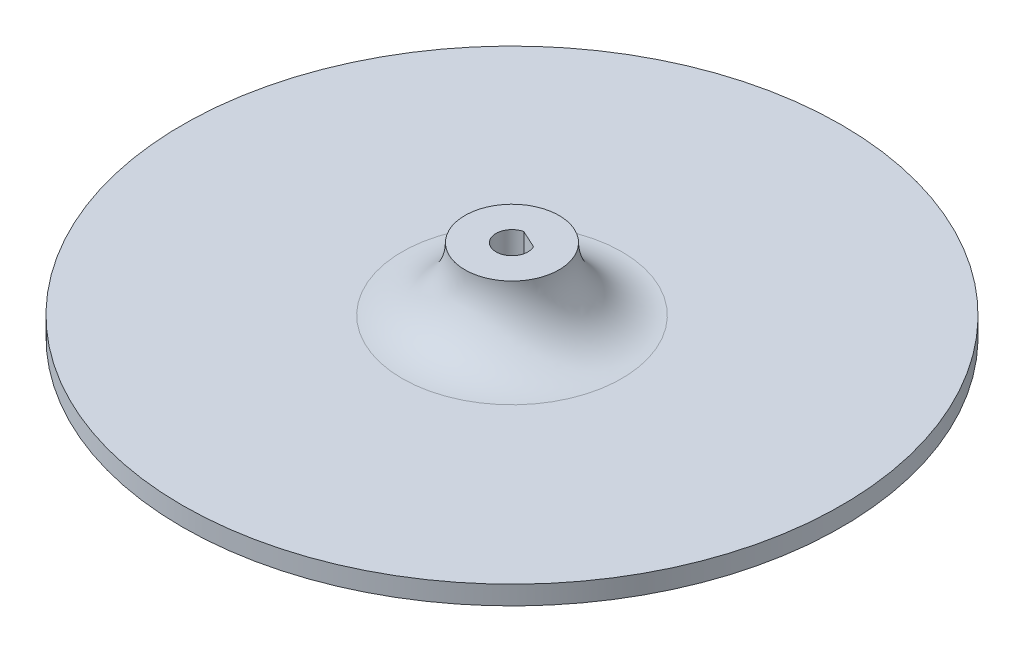
ISO-10303-21;
HEADER;
FILE_DESCRIPTION(('STEP AP214'),'2;1');
FILE_NAME('part.step','',(''),(''),'','','');
FILE_SCHEMA(('AUTOMOTIVE_DESIGN { 1 0 10303 214 1 1 1 1 }'));
ENDSEC;
DATA;
#1=APPLICATION_CONTEXT('core data for automotive mechanical design processes');
#2=APPLICATION_PROTOCOL_DEFINITION('international standard','automotive_design',2000,#1);
#3=PRODUCT_CONTEXT('',#1,'mechanical');
#4=PRODUCT('Part','Part','',(#3));
#5=PRODUCT_RELATED_PRODUCT_CATEGORY('part','',(#4));
#6=PRODUCT_DEFINITION_FORMATION('','',#4);
#7=PRODUCT_DEFINITION_CONTEXT('part definition',#1,'design');
#8=PRODUCT_DEFINITION('design','',#6,#7);
#9=PRODUCT_DEFINITION_SHAPE('','',#8);
#10=(LENGTH_UNIT() NAMED_UNIT(*) SI_UNIT(.MILLI.,.METRE.));
#11=(NAMED_UNIT(*) PLANE_ANGLE_UNIT() SI_UNIT($,.RADIAN.));
#12=(NAMED_UNIT(*) SI_UNIT($,.STERADIAN.) SOLID_ANGLE_UNIT());
#13=UNCERTAINTY_MEASURE_WITH_UNIT(LENGTH_MEASURE(1.E-05),#10,'distance_accuracy_value','');
#14=(GEOMETRIC_REPRESENTATION_CONTEXT(3) GLOBAL_UNCERTAINTY_ASSIGNED_CONTEXT((#13)) GLOBAL_UNIT_ASSIGNED_CONTEXT((#10,
#11,#12)) REPRESENTATION_CONTEXT('',''));
#15=CARTESIAN_POINT('',(0.,0.,0.));
#16=DIRECTION('',(0.,0.,1.));
#17=DIRECTION('',(1.,0.,0.));
#18=AXIS2_PLACEMENT_3D('',#15,#16,#17);
#19=CARTESIAN_POINT('',(0.,-3.,0.));
#20=DIRECTION('',(0.,1.,0.));
#21=DIRECTION('',(0.,0.,1.));
#22=AXIS2_PLACEMENT_3D('',#19,#20,#21);
#23=CYLINDRICAL_SURFACE('',#22,52.5);
#24=CARTESIAN_POINT('',(0.,-3.,0.));
#25=DIRECTION('',(0.,1.,0.));
#26=DIRECTION('',(0.,0.,1.));
#27=AXIS2_PLACEMENT_3D('',#24,#25,#26);
#28=CIRCLE('',#27,52.5);
#29=CARTESIAN_POINT('',(0.,-3.,52.5));
#30=VERTEX_POINT('',#29);
#31=EDGE_CURVE('E42',#30,#30,#28,.T.);
#32=ORIENTED_EDGE('',*,*,#31,.T.);
#33=EDGE_LOOP('',(#32));
#34=FACE_BOUND('',#33,.T.);
#35=CARTESIAN_POINT('',(0.,0.,0.));
#36=DIRECTION('',(0.,1.,0.));
#37=DIRECTION('',(0.,0.,1.));
#38=AXIS2_PLACEMENT_3D('',#35,#36,#37);
#39=CIRCLE('',#38,52.5);
#40=CARTESIAN_POINT('',(0.,0.,52.5));
#41=VERTEX_POINT('',#40);
#42=EDGE_CURVE('E80',#41,#41,#39,.T.);
#43=ORIENTED_EDGE('',*,*,#42,.F.);
#44=EDGE_LOOP('',(#43));
#45=FACE_BOUND('',#44,.T.);
#46=ADVANCED_FACE('F34',(#34,#45),#23,.T.);
#47=CARTESIAN_POINT('',(0.,-3.,0.));
#48=DIRECTION('',(0.,1.,0.));
#49=DIRECTION('',(0.,0.,1.));
#50=AXIS2_PLACEMENT_3D('',#47,#48,#49);
#51=PLANE('',#50);
#52=ORIENTED_EDGE('',*,*,#31,.F.);
#53=EDGE_LOOP('',(#52));
#54=FACE_BOUND('',#53,.T.);
#55=ADVANCED_FACE('F88',(#54),#51,.F.);
#56=CARTESIAN_POINT('',(0.,0.,0.));
#57=DIRECTION('',(0.,1.,0.));
#58=DIRECTION('',(0.,0.,1.));
#59=AXIS2_PLACEMENT_3D('',#56,#57,#58);
#60=PLANE('',#59);
#61=CARTESIAN_POINT('',(0.,0.,0.));
#62=DIRECTION('',(0.,1.,0.));
#63=DIRECTION('',(0.,0.,1.));
#64=AXIS2_PLACEMENT_3D('',#61,#62,#63);
#65=CIRCLE('',#64,17.5);
#66=CARTESIAN_POINT('',(0.,0.,17.5));
#67=VERTEX_POINT('',#66);
#68=EDGE_CURVE('E11',#67,#67,#65,.F.);
#69=ORIENTED_EDGE('',*,*,#68,.T.);
#70=EDGE_LOOP('',(#69));
#71=FACE_BOUND('',#70,.T.);
#72=ORIENTED_EDGE('',*,*,#42,.T.);
#73=EDGE_LOOP('',(#72));
#74=FACE_BOUND('',#73,.T.);
#75=ADVANCED_FACE('F85',(#71,#74),#60,.T.);
#76=CARTESIAN_POINT('',(0.835680038711691,10.,-1.81704124138634));
#77=DIRECTION('',(0.417840019355846,0.,-0.908520620693172));
#78=DIRECTION('',(-0.908520620693172,0.,-0.417840019355846));
#79=AXIS2_PLACEMENT_3D('',#76,#77,#78);
#80=PLANE('',#79);
#81=DIRECTION('',(0.908520620693172,0.,0.417840019355846));
#82=VECTOR('',#81,1.);
#83=CARTESIAN_POINT('',(0.835680038711691,0.,-1.81704124138634));
#84=LINE('',#83,#82);
#85=CARTESIAN_POINT('',(-0.601535261741699,0.,-2.47803456975106));
#86=VERTEX_POINT('',#85);
#87=CARTESIAN_POINT('',(2.27289533916508,0.,-1.15604791302162));
#88=VERTEX_POINT('',#87);
#89=EDGE_CURVE('E62',#86,#88,#84,.T.);
#90=ORIENTED_EDGE('',*,*,#89,.T.);
#91=DIRECTION('',(0.,-1.,0.));
#92=VECTOR('',#91,1.);
#93=CARTESIAN_POINT('',(2.27289533916508,10.,-1.15604791302162));
#94=LINE('',#93,#92);
#95=CARTESIAN_POINT('',(2.27289533916508,10.,-1.15604791302162));
#96=VERTEX_POINT('',#95);
#97=EDGE_CURVE('E70',#96,#88,#94,.T.);
#98=ORIENTED_EDGE('',*,*,#97,.F.);
#99=DIRECTION('',(0.908520620693172,0.,0.417840019355846));
#100=VECTOR('',#99,1.);
#101=CARTESIAN_POINT('',(0.835680038711691,10.,-1.81704124138634));
#102=LINE('',#101,#100);
#103=CARTESIAN_POINT('',(-0.601535261741699,10.,-2.47803456975106));
#104=VERTEX_POINT('',#103);
#105=EDGE_CURVE('E68',#104,#96,#102,.T.);
#106=ORIENTED_EDGE('',*,*,#105,.F.);
#107=DIRECTION('',(0.,-1.,0.));
#108=VECTOR('',#107,1.);
#109=CARTESIAN_POINT('',(-0.601535261741699,10.,-2.47803456975106));
#110=LINE('',#109,#108);
#111=EDGE_CURVE('E56',#104,#86,#110,.T.);
#112=ORIENTED_EDGE('',*,*,#111,.T.);
#113=EDGE_LOOP('',(#90,#98,#106,#112));
#114=FACE_BOUND('',#113,.T.);
#115=ADVANCED_FACE('F67',(#114),#80,.F.);
#116=CARTESIAN_POINT('',(0.,10.,0.));
#117=DIRECTION('',(0.,-1.,0.));
#118=DIRECTION('',(0.,0.,-1.));
#119=AXIS2_PLACEMENT_3D('',#116,#117,#118);
#120=CYLINDRICAL_SURFACE('',#119,2.55);
#121=CARTESIAN_POINT('',(0.,0.,0.));
#122=DIRECTION('',(0.,1.,0.));
#123=DIRECTION('',(0.,0.,1.));
#124=AXIS2_PLACEMENT_3D('',#121,#122,#123);
#125=CIRCLE('',#124,2.55);
#126=EDGE_CURVE('E48',#86,#88,#125,.T.);
#127=ORIENTED_EDGE('',*,*,#126,.F.);
#128=ORIENTED_EDGE('',*,*,#111,.F.);
#129=CARTESIAN_POINT('',(0.,10.,0.));
#130=DIRECTION('',(0.,1.,0.));
#131=DIRECTION('',(0.,0.,1.));
#132=AXIS2_PLACEMENT_3D('',#129,#130,#131);
#133=CIRCLE('',#132,2.55);
#134=EDGE_CURVE('E75',#104,#96,#133,.T.);
#135=ORIENTED_EDGE('',*,*,#134,.T.);
#136=ORIENTED_EDGE('',*,*,#97,.T.);
#137=EDGE_LOOP('',(#127,#128,#135,#136));
#138=FACE_BOUND('',#137,.T.);
#139=ADVANCED_FACE('F73',(#138),#120,.F.);
#140=CARTESIAN_POINT('',(0.,10.,0.));
#141=DIRECTION('',(0.,1.,0.));
#142=DIRECTION('',(0.,0.,1.));
#143=AXIS2_PLACEMENT_3D('',#140,#141,#142);
#144=PLANE('',#143);
#145=ORIENTED_EDGE('',*,*,#105,.T.);
#146=ORIENTED_EDGE('',*,*,#134,.F.);
#147=EDGE_LOOP('',(#145,#146));
#148=FACE_BOUND('',#147,.T.);
#149=CARTESIAN_POINT('',(0.,10.,0.));
#150=DIRECTION('',(0.,1.,0.));
#151=DIRECTION('',(0.,0.,1.));
#152=AXIS2_PLACEMENT_3D('',#149,#150,#151);
#153=CIRCLE('',#152,7.5);
#154=CARTESIAN_POINT('',(0.,10.,7.5));
#155=VERTEX_POINT('',#154);
#156=EDGE_CURVE('E71',#155,#155,#153,.T.);
#157=ORIENTED_EDGE('',*,*,#156,.T.);
#158=EDGE_LOOP('',(#157));
#159=FACE_BOUND('',#158,.T.);
#160=ADVANCED_FACE('F103',(#148,#159),#144,.T.);
#161=ORIENTED_EDGE('',*,*,#126,.T.);
#162=ORIENTED_EDGE('',*,*,#89,.F.);
#163=EDGE_LOOP('',(#161,#162));
#164=FACE_BOUND('',#163,.T.);
#165=ADVANCED_FACE('F63',(#164),#60,.T.);
#166=CARTESIAN_POINT('',(0.,10.,0.));
#167=DIRECTION('',(0.,1.,0.));
#168=DIRECTION('',(0.,0.,1.));
#169=AXIS2_PLACEMENT_3D('',#166,#167,#168);
#170=TOROIDAL_SURFACE('',#169,17.5,10.);
#171=ORIENTED_EDGE('',*,*,#68,.F.);
#172=EDGE_LOOP('',(#171));
#173=FACE_BOUND('',#172,.T.);
#174=ORIENTED_EDGE('',*,*,#156,.F.);
#175=EDGE_LOOP('',(#174));
#176=FACE_BOUND('',#175,.T.);
#177=ADVANCED_FACE('F36',(#173,#176),#170,.F.);
#178=CLOSED_SHELL('',(#46,#55,#75,#115,#139,#160,#165,#177));
#179=MANIFOLD_SOLID_BREP('B2',#178);
#180=ADVANCED_BREP_SHAPE_REPRESENTATION('',(#18,#179),#14);
#181=SHAPE_DEFINITION_REPRESENTATION(#9,#180);
ENDSEC;
END-ISO-10303-21;
